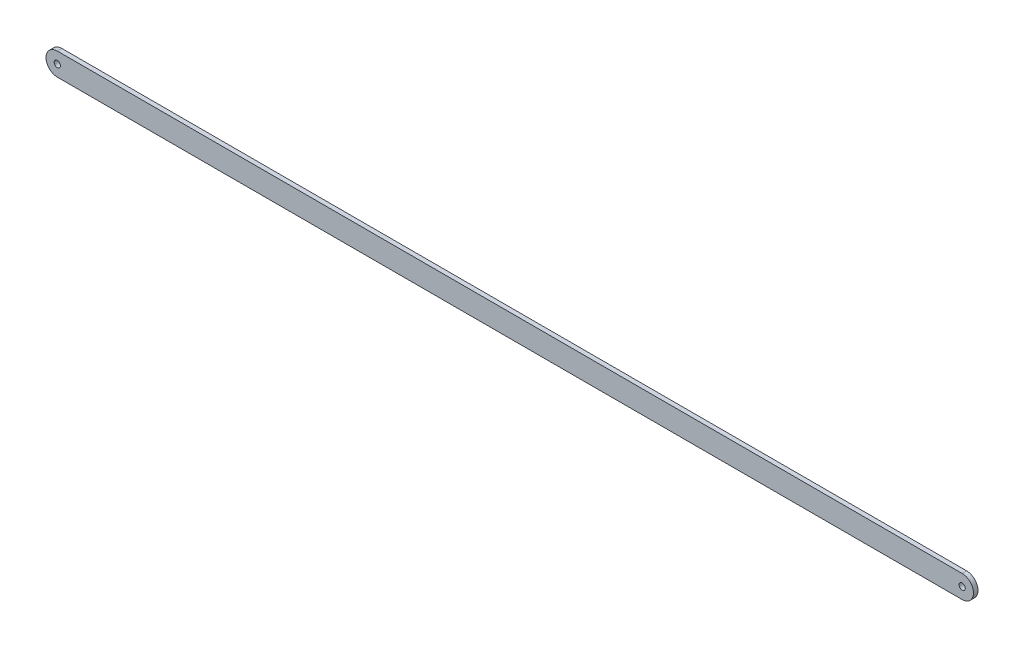
ISO-10303-21;
HEADER;
FILE_DESCRIPTION(('STEP AP214'),'2;1');
FILE_NAME('part.step','',(''),(''),'','','');
FILE_SCHEMA(('AUTOMOTIVE_DESIGN { 1 0 10303 214 1 1 1 1 }'));
ENDSEC;
DATA;
#1=APPLICATION_CONTEXT('core data for automotive mechanical design processes');
#2=APPLICATION_PROTOCOL_DEFINITION('international standard','automotive_design',2000,#1);
#3=PRODUCT_CONTEXT('',#1,'mechanical');
#4=PRODUCT('Part','Part','',(#3));
#5=PRODUCT_RELATED_PRODUCT_CATEGORY('part','',(#4));
#6=PRODUCT_DEFINITION_FORMATION('','',#4);
#7=PRODUCT_DEFINITION_CONTEXT('part definition',#1,'design');
#8=PRODUCT_DEFINITION('design','',#6,#7);
#9=PRODUCT_DEFINITION_SHAPE('','',#8);
#10=(LENGTH_UNIT() NAMED_UNIT(*) SI_UNIT(.MILLI.,.METRE.));
#11=(NAMED_UNIT(*) PLANE_ANGLE_UNIT() SI_UNIT($,.RADIAN.));
#12=(NAMED_UNIT(*) SI_UNIT($,.STERADIAN.) SOLID_ANGLE_UNIT());
#13=UNCERTAINTY_MEASURE_WITH_UNIT(LENGTH_MEASURE(1.E-05),#10,'distance_accuracy_value','');
#14=(GEOMETRIC_REPRESENTATION_CONTEXT(3) GLOBAL_UNCERTAINTY_ASSIGNED_CONTEXT((#13)) GLOBAL_UNIT_ASSIGNED_CONTEXT((#10,
#11,#12)) REPRESENTATION_CONTEXT('',''));
#15=CARTESIAN_POINT('',(0.,0.,0.));
#16=DIRECTION('',(0.,0.,1.));
#17=DIRECTION('',(1.,0.,0.));
#18=AXIS2_PLACEMENT_3D('',#15,#16,#17);
#19=CARTESIAN_POINT('',(400.,0.,4.));
#20=DIRECTION('',(0.,0.,-1.));
#21=DIRECTION('',(-1.,0.,0.));
#22=AXIS2_PLACEMENT_3D('',#19,#20,#21);
#23=PLANE('',#22);
#24=CARTESIAN_POINT('',(400.,0.,4.));
#25=DIRECTION('',(0.,0.,1.));
#26=DIRECTION('',(-1.,0.,0.));
#27=AXIS2_PLACEMENT_3D('',#24,#25,#26);
#28=CIRCLE('',#27,10.);
#29=CARTESIAN_POINT('',(400.,-10.0000000000001,4.));
#30=VERTEX_POINT('',#29);
#31=CARTESIAN_POINT('',(400.,9.99999999999992,4.));
#32=VERTEX_POINT('',#31);
#33=EDGE_CURVE('E84',#30,#32,#28,.T.);
#34=ORIENTED_EDGE('',*,*,#33,.T.);
#35=DIRECTION('',(-1.,0.,0.));
#36=VECTOR('',#35,1.);
#37=CARTESIAN_POINT('',(-400.,9.99999999999981,4.));
#38=LINE('',#37,#36);
#39=CARTESIAN_POINT('',(-400.,9.99999999999981,4.));
#40=VERTEX_POINT('',#39);
#41=EDGE_CURVE('E79',#32,#40,#38,.T.);
#42=ORIENTED_EDGE('',*,*,#41,.T.);
#43=CARTESIAN_POINT('',(-400.,-1.94766602289596E-13,4.));
#44=DIRECTION('',(0.,0.,1.));
#45=DIRECTION('',(1.,0.,0.));
#46=AXIS2_PLACEMENT_3D('',#43,#44,#45);
#47=CIRCLE('',#46,9.99999999999999);
#48=CARTESIAN_POINT('',(-400.,-10.0000000000002,4.));
#49=VERTEX_POINT('',#48);
#50=EDGE_CURVE('E82',#40,#49,#47,.T.);
#51=ORIENTED_EDGE('',*,*,#50,.T.);
#52=DIRECTION('',(1.,0.,0.));
#53=VECTOR('',#52,1.);
#54=CARTESIAN_POINT('',(-400.,-10.0000000000002,4.));
#55=LINE('',#54,#53);
#56=EDGE_CURVE('E49',#49,#30,#55,.T.);
#57=ORIENTED_EDGE('',*,*,#56,.T.);
#58=EDGE_LOOP('',(#34,#42,#51,#57));
#59=FACE_BOUND('',#58,.T.);
#60=CARTESIAN_POINT('',(-400.,-1.94766602289596E-13,4.));
#61=DIRECTION('',(0.,0.,1.));
#62=DIRECTION('',(1.,0.,0.));
#63=AXIS2_PLACEMENT_3D('',#60,#61,#62);
#64=CIRCLE('',#63,2.75000000000004);
#65=CARTESIAN_POINT('',(-397.25,-1.94766602289596E-13,4.));
#66=VERTEX_POINT('',#65);
#67=EDGE_CURVE('E99',#66,#66,#64,.T.);
#68=ORIENTED_EDGE('',*,*,#67,.F.);
#69=EDGE_LOOP('',(#68));
#70=FACE_BOUND('',#69,.T.);
#71=CARTESIAN_POINT('',(400.,0.,4.));
#72=DIRECTION('',(0.,0.,1.));
#73=DIRECTION('',(-1.,0.,0.));
#74=AXIS2_PLACEMENT_3D('',#71,#72,#73);
#75=CIRCLE('',#74,2.75000000000004);
#76=CARTESIAN_POINT('',(397.25,0.,4.));
#77=VERTEX_POINT('',#76);
#78=EDGE_CURVE('E114',#77,#77,#75,.T.);
#79=ORIENTED_EDGE('',*,*,#78,.F.);
#80=EDGE_LOOP('',(#79));
#81=FACE_BOUND('',#80,.T.);
#82=ADVANCED_FACE('F32',(#59,#70,#81),#23,.F.);
#83=CARTESIAN_POINT('',(400.,0.,0.));
#84=DIRECTION('',(0.,0.,-1.));
#85=DIRECTION('',(-1.,0.,0.));
#86=AXIS2_PLACEMENT_3D('',#83,#84,#85);
#87=PLANE('',#86);
#88=CARTESIAN_POINT('',(-400.,-1.94766602289596E-13,0.));
#89=DIRECTION('',(0.,0.,1.));
#90=DIRECTION('',(1.,0.,0.));
#91=AXIS2_PLACEMENT_3D('',#88,#89,#90);
#92=CIRCLE('',#91,2.75000000000004);
#93=CARTESIAN_POINT('',(-397.25,-1.94766602289596E-13,0.));
#94=VERTEX_POINT('',#93);
#95=EDGE_CURVE('E111',#94,#94,#92,.T.);
#96=ORIENTED_EDGE('',*,*,#95,.T.);
#97=EDGE_LOOP('',(#96));
#98=FACE_BOUND('',#97,.T.);
#99=CARTESIAN_POINT('',(400.,0.,0.));
#100=DIRECTION('',(0.,0.,1.));
#101=DIRECTION('',(-1.,0.,0.));
#102=AXIS2_PLACEMENT_3D('',#99,#100,#101);
#103=CIRCLE('',#102,10.);
#104=CARTESIAN_POINT('',(400.,-10.0000000000001,0.));
#105=VERTEX_POINT('',#104);
#106=CARTESIAN_POINT('',(400.,9.99999999999992,0.));
#107=VERTEX_POINT('',#106);
#108=EDGE_CURVE('E96',#105,#107,#103,.T.);
#109=ORIENTED_EDGE('',*,*,#108,.F.);
#110=DIRECTION('',(1.,0.,0.));
#111=VECTOR('',#110,1.);
#112=CARTESIAN_POINT('',(-400.,-10.0000000000002,0.));
#113=LINE('',#112,#111);
#114=CARTESIAN_POINT('',(-400.,-10.0000000000002,0.));
#115=VERTEX_POINT('',#114);
#116=EDGE_CURVE('E72',#115,#105,#113,.T.);
#117=ORIENTED_EDGE('',*,*,#116,.F.);
#118=CARTESIAN_POINT('',(-400.,-1.94766602289596E-13,0.));
#119=DIRECTION('',(0.,0.,1.));
#120=DIRECTION('',(1.,0.,0.));
#121=AXIS2_PLACEMENT_3D('',#118,#119,#120);
#122=CIRCLE('',#121,9.99999999999999);
#123=CARTESIAN_POINT('',(-400.,9.99999999999981,0.));
#124=VERTEX_POINT('',#123);
#125=EDGE_CURVE('E66',#124,#115,#122,.T.);
#126=ORIENTED_EDGE('',*,*,#125,.F.);
#127=DIRECTION('',(-1.,0.,0.));
#128=VECTOR('',#127,1.);
#129=CARTESIAN_POINT('',(-400.,9.99999999999981,0.));
#130=LINE('',#129,#128);
#131=EDGE_CURVE('E88',#107,#124,#130,.T.);
#132=ORIENTED_EDGE('',*,*,#131,.F.);
#133=EDGE_LOOP('',(#109,#117,#126,#132));
#134=FACE_BOUND('',#133,.T.);
#135=CARTESIAN_POINT('',(400.,0.,0.));
#136=DIRECTION('',(0.,0.,1.));
#137=DIRECTION('',(-1.,0.,0.));
#138=AXIS2_PLACEMENT_3D('',#135,#136,#137);
#139=CIRCLE('',#138,2.75000000000004);
#140=CARTESIAN_POINT('',(397.25,0.,0.));
#141=VERTEX_POINT('',#140);
#142=EDGE_CURVE('E117',#141,#141,#139,.T.);
#143=ORIENTED_EDGE('',*,*,#142,.T.);
#144=EDGE_LOOP('',(#143));
#145=FACE_BOUND('',#144,.T.);
#146=ADVANCED_FACE('F107',(#98,#134,#145),#87,.T.);
#147=CARTESIAN_POINT('',(400.,0.,4.));
#148=DIRECTION('',(0.,0.,-1.));
#149=DIRECTION('',(-1.,0.,0.));
#150=AXIS2_PLACEMENT_3D('',#147,#148,#149);
#151=CYLINDRICAL_SURFACE('',#150,10.);
#152=ORIENTED_EDGE('',*,*,#108,.T.);
#153=DIRECTION('',(0.,0.,-1.));
#154=VECTOR('',#153,1.);
#155=CARTESIAN_POINT('',(400.,9.99999999999992,4.));
#156=LINE('',#155,#154);
#157=EDGE_CURVE('E11',#32,#107,#156,.T.);
#158=ORIENTED_EDGE('',*,*,#157,.F.);
#159=ORIENTED_EDGE('',*,*,#33,.F.);
#160=DIRECTION('',(0.,0.,-1.));
#161=VECTOR('',#160,1.);
#162=CARTESIAN_POINT('',(400.,-10.0000000000001,4.));
#163=LINE('',#162,#161);
#164=EDGE_CURVE('E92',#30,#105,#163,.T.);
#165=ORIENTED_EDGE('',*,*,#164,.T.);
#166=EDGE_LOOP('',(#152,#158,#159,#165));
#167=FACE_BOUND('',#166,.T.);
#168=ADVANCED_FACE('F34',(#167),#151,.T.);
#169=CARTESIAN_POINT('',(-400.,9.99999999999981,4.));
#170=DIRECTION('',(0.,-1.,0.));
#171=DIRECTION('',(1.,0.,0.));
#172=AXIS2_PLACEMENT_3D('',#169,#170,#171);
#173=PLANE('',#172);
#174=ORIENTED_EDGE('',*,*,#131,.T.);
#175=DIRECTION('',(0.,0.,-1.));
#176=VECTOR('',#175,1.);
#177=CARTESIAN_POINT('',(-400.,9.99999999999981,4.));
#178=LINE('',#177,#176);
#179=EDGE_CURVE('E41',#40,#124,#178,.T.);
#180=ORIENTED_EDGE('',*,*,#179,.F.);
#181=ORIENTED_EDGE('',*,*,#41,.F.);
#182=ORIENTED_EDGE('',*,*,#157,.T.);
#183=EDGE_LOOP('',(#174,#180,#181,#182));
#184=FACE_BOUND('',#183,.T.);
#185=ADVANCED_FACE('F87',(#184),#173,.F.);
#186=CARTESIAN_POINT('',(-400.,-1.94766602289596E-13,4.));
#187=DIRECTION('',(0.,0.,-1.));
#188=DIRECTION('',(-1.,0.,0.));
#189=AXIS2_PLACEMENT_3D('',#186,#187,#188);
#190=CYLINDRICAL_SURFACE('',#189,9.99999999999999);
#191=ORIENTED_EDGE('',*,*,#125,.T.);
#192=DIRECTION('',(0.,0.,-1.));
#193=VECTOR('',#192,1.);
#194=CARTESIAN_POINT('',(-400.,-10.0000000000002,4.));
#195=LINE('',#194,#193);
#196=EDGE_CURVE('E89',#49,#115,#195,.T.);
#197=ORIENTED_EDGE('',*,*,#196,.F.);
#198=ORIENTED_EDGE('',*,*,#50,.F.);
#199=ORIENTED_EDGE('',*,*,#179,.T.);
#200=EDGE_LOOP('',(#191,#197,#198,#199));
#201=FACE_BOUND('',#200,.T.);
#202=ADVANCED_FACE('F90',(#201),#190,.T.);
#203=CARTESIAN_POINT('',(-400.,-10.0000000000002,4.));
#204=DIRECTION('',(0.,1.,0.));
#205=DIRECTION('',(-1.,0.,0.));
#206=AXIS2_PLACEMENT_3D('',#203,#204,#205);
#207=PLANE('',#206);
#208=ORIENTED_EDGE('',*,*,#116,.T.);
#209=ORIENTED_EDGE('',*,*,#164,.F.);
#210=ORIENTED_EDGE('',*,*,#56,.F.);
#211=ORIENTED_EDGE('',*,*,#196,.T.);
#212=EDGE_LOOP('',(#208,#209,#210,#211));
#213=FACE_BOUND('',#212,.T.);
#214=ADVANCED_FACE('F104',(#213),#207,.F.);
#215=CARTESIAN_POINT('',(-400.,-1.94766602289596E-13,4.));
#216=DIRECTION('',(0.,0.,-1.));
#217=DIRECTION('',(-1.,0.,0.));
#218=AXIS2_PLACEMENT_3D('',#215,#216,#217);
#219=CYLINDRICAL_SURFACE('',#218,2.75000000000004);
#220=ORIENTED_EDGE('',*,*,#67,.T.);
#221=EDGE_LOOP('',(#220));
#222=FACE_BOUND('',#221,.T.);
#223=ORIENTED_EDGE('',*,*,#95,.F.);
#224=EDGE_LOOP('',(#223));
#225=FACE_BOUND('',#224,.T.);
#226=ADVANCED_FACE('F134',(#222,#225),#219,.F.);
#227=CARTESIAN_POINT('',(400.,0.,4.));
#228=DIRECTION('',(0.,0.,-1.));
#229=DIRECTION('',(-1.,0.,0.));
#230=AXIS2_PLACEMENT_3D('',#227,#228,#229);
#231=CYLINDRICAL_SURFACE('',#230,2.75000000000004);
#232=ORIENTED_EDGE('',*,*,#78,.T.);
#233=EDGE_LOOP('',(#232));
#234=FACE_BOUND('',#233,.T.);
#235=ORIENTED_EDGE('',*,*,#142,.F.);
#236=EDGE_LOOP('',(#235));
#237=FACE_BOUND('',#236,.T.);
#238=ADVANCED_FACE('F123',(#234,#237),#231,.F.);
#239=CLOSED_SHELL('',(#82,#146,#168,#185,#202,#214,#226,#238));
#240=MANIFOLD_SOLID_BREP('B2',#239);
#241=ADVANCED_BREP_SHAPE_REPRESENTATION('',(#18,#240),#14);
#242=SHAPE_DEFINITION_REPRESENTATION(#9,#241);
ENDSEC;
END-ISO-10303-21;
